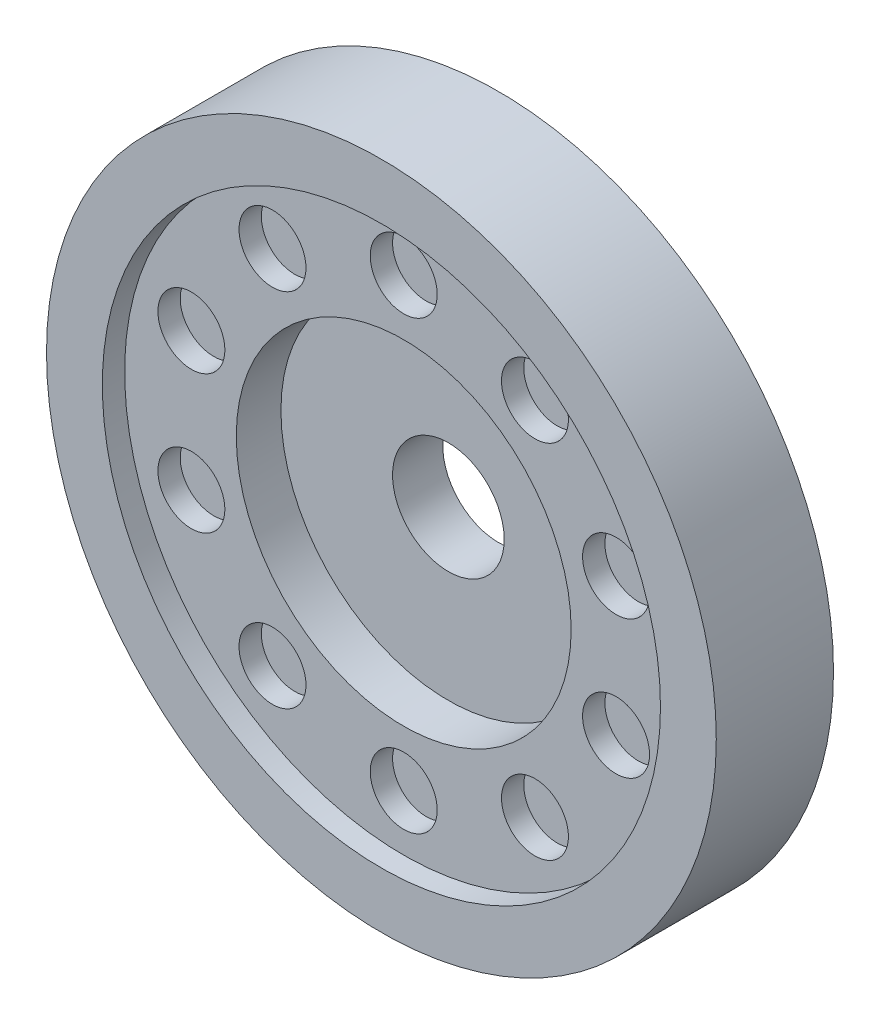
ISO-10303-21;
HEADER;
FILE_DESCRIPTION(('STEP AP214'),'2;1');
FILE_NAME('part.step','',(''),(''),'','','');
FILE_SCHEMA(('AUTOMOTIVE_DESIGN { 1 0 10303 214 1 1 1 1 }'));
ENDSEC;
DATA;
#1=APPLICATION_CONTEXT('core data for automotive mechanical design processes');
#2=APPLICATION_PROTOCOL_DEFINITION('international standard','automotive_design',2000,#1);
#3=PRODUCT_CONTEXT('',#1,'mechanical');
#4=PRODUCT('Part','Part','',(#3));
#5=PRODUCT_RELATED_PRODUCT_CATEGORY('part','',(#4));
#6=PRODUCT_DEFINITION_FORMATION('','',#4);
#7=PRODUCT_DEFINITION_CONTEXT('part definition',#1,'design');
#8=PRODUCT_DEFINITION('design','',#6,#7);
#9=PRODUCT_DEFINITION_SHAPE('','',#8);
#10=(LENGTH_UNIT() NAMED_UNIT(*) SI_UNIT(.MILLI.,.METRE.));
#11=(NAMED_UNIT(*) PLANE_ANGLE_UNIT() SI_UNIT($,.RADIAN.));
#12=(NAMED_UNIT(*) SI_UNIT($,.STERADIAN.) SOLID_ANGLE_UNIT());
#13=UNCERTAINTY_MEASURE_WITH_UNIT(LENGTH_MEASURE(1.E-05),#10,'distance_accuracy_value','');
#14=(GEOMETRIC_REPRESENTATION_CONTEXT(3) GLOBAL_UNCERTAINTY_ASSIGNED_CONTEXT((#13)) GLOBAL_UNIT_ASSIGNED_CONTEXT((#10,
#11,#12)) REPRESENTATION_CONTEXT('',''));
#15=CARTESIAN_POINT('',(0.,0.,0.));
#16=DIRECTION('',(0.,0.,1.));
#17=DIRECTION('',(1.,0.,0.));
#18=AXIS2_PLACEMENT_3D('',#15,#16,#17);
#19=CARTESIAN_POINT('',(0.,0.,133.35));
#20=DIRECTION('',(0.,0.,-1.));
#21=DIRECTION('',(-1.,0.,0.));
#22=AXIS2_PLACEMENT_3D('',#19,#20,#21);
#23=CYLINDRICAL_SURFACE('',#22,381.);
#24=CARTESIAN_POINT('',(0.,0.,133.35));
#25=DIRECTION('',(0.,0.,1.));
#26=DIRECTION('',(1.,0.,0.));
#27=AXIS2_PLACEMENT_3D('',#24,#25,#26);
#28=CIRCLE('',#27,381.);
#29=CARTESIAN_POINT('',(381.,0.,133.35));
#30=VERTEX_POINT('',#29);
#31=EDGE_CURVE('E10',#30,#30,#28,.T.);
#32=ORIENTED_EDGE('',*,*,#31,.F.);
#33=EDGE_LOOP('',(#32));
#34=FACE_BOUND('',#33,.T.);
#35=CARTESIAN_POINT('',(0.,0.,0.));
#36=DIRECTION('',(0.,0.,1.));
#37=DIRECTION('',(1.,0.,0.));
#38=AXIS2_PLACEMENT_3D('',#35,#36,#37);
#39=CIRCLE('',#38,381.);
#40=CARTESIAN_POINT('',(381.,0.,0.));
#41=VERTEX_POINT('',#40);
#42=EDGE_CURVE('E34',#41,#41,#39,.T.);
#43=ORIENTED_EDGE('',*,*,#42,.T.);
#44=EDGE_LOOP('',(#43));
#45=FACE_BOUND('',#44,.T.);
#46=ADVANCED_FACE('F31',(#34,#45),#23,.T.);
#47=CARTESIAN_POINT('',(0.,0.,133.35));
#48=DIRECTION('',(0.,0.,1.));
#49=DIRECTION('',(1.,0.,0.));
#50=AXIS2_PLACEMENT_3D('',#47,#48,#49);
#51=PLANE('',#50);
#52=CARTESIAN_POINT('',(0.,0.,133.35));
#53=DIRECTION('',(0.,0.,1.));
#54=DIRECTION('',(1.,0.,0.));
#55=AXIS2_PLACEMENT_3D('',#52,#53,#54);
#56=CIRCLE('',#55,317.5);
#57=CARTESIAN_POINT('',(317.5,0.,133.35));
#58=VERTEX_POINT('',#57);
#59=EDGE_CURVE('E43',#58,#58,#56,.T.);
#60=ORIENTED_EDGE('',*,*,#59,.F.);
#61=EDGE_LOOP('',(#60));
#62=FACE_BOUND('',#61,.T.);
#63=ORIENTED_EDGE('',*,*,#31,.T.);
#64=EDGE_LOOP('',(#63));
#65=FACE_BOUND('',#64,.T.);
#66=ADVANCED_FACE('F176',(#62,#65),#51,.T.);
#67=CARTESIAN_POINT('',(0.,0.,0.));
#68=DIRECTION('',(0.,0.,1.));
#69=DIRECTION('',(1.,0.,0.));
#70=AXIS2_PLACEMENT_3D('',#67,#68,#69);
#71=PLANE('',#70);
#72=CARTESIAN_POINT('',(0.,0.,0.));
#73=DIRECTION('',(0.,0.,1.));
#74=DIRECTION('',(1.,0.,0.));
#75=AXIS2_PLACEMENT_3D('',#72,#73,#74);
#76=CIRCLE('',#75,63.5);
#77=CARTESIAN_POINT('',(63.5,0.,0.));
#78=VERTEX_POINT('',#77);
#79=EDGE_CURVE('E112',#78,#78,#76,.T.);
#80=ORIENTED_EDGE('',*,*,#79,.T.);
#81=EDGE_LOOP('',(#80));
#82=FACE_BOUND('',#81,.T.);
#83=ORIENTED_EDGE('',*,*,#42,.F.);
#84=EDGE_LOOP('',(#83));
#85=FACE_BOUND('',#84,.T.);
#86=ADVANCED_FACE('F121',(#82,#85),#71,.F.);
#87=CARTESIAN_POINT('',(0.,0.,107.95));
#88=DIRECTION('',(0.,0.,1.));
#89=DIRECTION('',(1.,0.,0.));
#90=AXIS2_PLACEMENT_3D('',#87,#88,#89);
#91=CYLINDRICAL_SURFACE('',#90,317.5);
#92=CARTESIAN_POINT('',(0.,0.,107.95));
#93=DIRECTION('',(0.,0.,1.));
#94=DIRECTION('',(1.,0.,0.));
#95=AXIS2_PLACEMENT_3D('',#92,#93,#94);
#96=CIRCLE('',#95,317.5);
#97=CARTESIAN_POINT('',(317.5,0.,107.95));
#98=VERTEX_POINT('',#97);
#99=EDGE_CURVE('E41',#98,#98,#96,.T.);
#100=ORIENTED_EDGE('',*,*,#99,.F.);
#101=EDGE_LOOP('',(#100));
#102=FACE_BOUND('',#101,.T.);
#103=ORIENTED_EDGE('',*,*,#59,.T.);
#104=EDGE_LOOP('',(#103));
#105=FACE_BOUND('',#104,.T.);
#106=ADVANCED_FACE('F147',(#102,#105),#91,.F.);
#107=CARTESIAN_POINT('',(0.,0.,107.95));
#108=DIRECTION('',(0.,0.,1.));
#109=DIRECTION('',(1.,0.,0.));
#110=AXIS2_PLACEMENT_3D('',#107,#108,#109);
#111=PLANE('',#110);
#112=CARTESIAN_POINT('',(0.,0.,107.95));
#113=DIRECTION('',(0.,0.,1.));
#114=DIRECTION('',(1.,0.,0.));
#115=AXIS2_PLACEMENT_3D('',#112,#113,#114);
#116=CIRCLE('',#115,190.5);
#117=CARTESIAN_POINT('',(190.5,0.,107.95));
#118=VERTEX_POINT('',#117);
#119=EDGE_CURVE('E109',#118,#118,#116,.T.);
#120=ORIENTED_EDGE('',*,*,#119,.F.);
#121=EDGE_LOOP('',(#120));
#122=FACE_BOUND('',#121,.T.);
#123=CARTESIAN_POINT('',(149.297454082294,205.490316571254,107.95));
#124=DIRECTION('',(0.,0.,1.));
#125=DIRECTION('',(1.,0.,0.));
#126=AXIS2_PLACEMENT_3D('',#123,#124,#125);
#127=CIRCLE('',#126,38.1000000000007);
#128=CARTESIAN_POINT('',(187.397454082294,205.490316571254,107.95));
#129=VERTEX_POINT('',#128);
#130=EDGE_CURVE('E98',#129,#129,#127,.T.);
#131=ORIENTED_EDGE('',*,*,#130,.F.);
#132=EDGE_LOOP('',(#131));
#133=FACE_BOUND('',#132,.T.);
#134=CARTESIAN_POINT('',(241.568355138989,78.4903165712641,107.95));
#135=DIRECTION('',(0.,0.,1.));
#136=DIRECTION('',(1.,0.,0.));
#137=AXIS2_PLACEMENT_3D('',#134,#135,#136);
#138=CIRCLE('',#137,38.1000000000118);
#139=CARTESIAN_POINT('',(279.668355139001,78.4903165712641,107.95));
#140=VERTEX_POINT('',#139);
#141=EDGE_CURVE('E92',#140,#140,#138,.T.);
#142=ORIENTED_EDGE('',*,*,#141,.F.);
#143=EDGE_LOOP('',(#142));
#144=FACE_BOUND('',#143,.T.);
#145=CARTESIAN_POINT('',(241.568355139007,-78.4903165712092,107.95));
#146=DIRECTION('',(0.,0.,1.));
#147=DIRECTION('',(1.,0.,0.));
#148=AXIS2_PLACEMENT_3D('',#145,#146,#147);
#149=CIRCLE('',#148,38.1000000000292);
#150=CARTESIAN_POINT('',(279.668355139036,-78.4903165712092,107.95));
#151=VERTEX_POINT('',#150);
#152=EDGE_CURVE('E86',#151,#151,#149,.T.);
#153=ORIENTED_EDGE('',*,*,#152,.F.);
#154=EDGE_LOOP('',(#153));
#155=FACE_BOUND('',#154,.T.);
#156=CARTESIAN_POINT('',(149.29745408234,-205.49031657122,107.95));
#157=DIRECTION('',(0.,0.,1.));
#158=DIRECTION('',(1.,0.,0.));
#159=AXIS2_PLACEMENT_3D('',#156,#157,#158);
#160=CIRCLE('',#159,38.1000000000463);
#161=CARTESIAN_POINT('',(187.397454082387,-205.49031657122,107.95));
#162=VERTEX_POINT('',#161);
#163=EDGE_CURVE('E80',#162,#162,#160,.T.);
#164=ORIENTED_EDGE('',*,*,#163,.F.);
#165=EDGE_LOOP('',(#164));
#166=FACE_BOUND('',#165,.T.);
#167=CARTESIAN_POINT('',(5.76907015051843E-11,-254.,107.95));
#168=DIRECTION('',(0.,0.,1.));
#169=DIRECTION('',(1.,0.,0.));
#170=AXIS2_PLACEMENT_3D('',#167,#168,#169);
#171=CIRCLE('',#170,38.1000000000569);
#172=CARTESIAN_POINT('',(38.1000000001146,-254.,107.95));
#173=VERTEX_POINT('',#172);
#174=EDGE_CURVE('E74',#173,#173,#171,.T.);
#175=ORIENTED_EDGE('',*,*,#174,.F.);
#176=EDGE_LOOP('',(#175));
#177=FACE_BOUND('',#176,.T.);
#178=CARTESIAN_POINT('',(-149.297454082236,-205.490316571254,107.95));
#179=DIRECTION('',(0.,0.,1.));
#180=DIRECTION('',(1.,0.,0.));
#181=AXIS2_PLACEMENT_3D('',#178,#179,#180);
#182=CIRCLE('',#181,38.100000000057);
#183=CARTESIAN_POINT('',(-111.197454082179,-205.490316571254,107.95));
#184=VERTEX_POINT('',#183);
#185=EDGE_CURVE('E68',#184,#184,#182,.T.);
#186=ORIENTED_EDGE('',*,*,#185,.F.);
#187=EDGE_LOOP('',(#186));
#188=FACE_BOUND('',#187,.T.);
#189=CARTESIAN_POINT('',(-241.568355138931,-78.4903165712641,107.95));
#190=DIRECTION('',(0.,0.,1.));
#191=DIRECTION('',(1.,0.,0.));
#192=AXIS2_PLACEMENT_3D('',#189,#190,#191);
#193=CIRCLE('',#192,38.1000000000465);
#194=CARTESIAN_POINT('',(-203.468355138885,-78.4903165712641,107.95));
#195=VERTEX_POINT('',#194);
#196=EDGE_CURVE('E62',#195,#195,#193,.T.);
#197=ORIENTED_EDGE('',*,*,#196,.F.);
#198=EDGE_LOOP('',(#197));
#199=FACE_BOUND('',#198,.T.);
#200=CARTESIAN_POINT('',(-241.568355138949,78.4903165712092,107.95));
#201=DIRECTION('',(0.,0.,1.));
#202=DIRECTION('',(1.,0.,0.));
#203=AXIS2_PLACEMENT_3D('',#200,#201,#202);
#204=CIRCLE('',#203,38.1000000000299);
#205=CARTESIAN_POINT('',(-203.468355138919,78.4903165712092,107.95));
#206=VERTEX_POINT('',#205);
#207=EDGE_CURVE('E55',#206,#206,#204,.T.);
#208=ORIENTED_EDGE('',*,*,#207,.F.);
#209=EDGE_LOOP('',(#208));
#210=FACE_BOUND('',#209,.T.);
#211=CARTESIAN_POINT('',(-149.297454082283,205.49031657122,107.95));
#212=DIRECTION('',(0.,0.,1.));
#213=DIRECTION('',(1.,0.,0.));
#214=AXIS2_PLACEMENT_3D('',#211,#212,#213);
#215=CIRCLE('',#214,38.1000000000135);
#216=CARTESIAN_POINT('',(-111.197454082269,205.49031657122,107.95));
#217=VERTEX_POINT('',#216);
#218=EDGE_CURVE('E103',#217,#217,#215,.T.);
#219=ORIENTED_EDGE('',*,*,#218,.F.);
#220=EDGE_LOOP('',(#219));
#221=FACE_BOUND('',#220,.T.);
#222=CARTESIAN_POINT('',(0.,254.,107.95));
#223=DIRECTION('',(0.,0.,1.));
#224=DIRECTION('',(1.,0.,0.));
#225=AXIS2_PLACEMENT_3D('',#222,#223,#224);
#226=CIRCLE('',#225,38.1);
#227=CARTESIAN_POINT('',(38.1,254.,107.95));
#228=VERTEX_POINT('',#227);
#229=EDGE_CURVE('E49',#228,#228,#226,.T.);
#230=ORIENTED_EDGE('',*,*,#229,.F.);
#231=EDGE_LOOP('',(#230));
#232=FACE_BOUND('',#231,.T.);
#233=ORIENTED_EDGE('',*,*,#99,.T.);
#234=EDGE_LOOP('',(#233));
#235=FACE_BOUND('',#234,.T.);
#236=ADVANCED_FACE('F143',(#122,#133,#144,#155,#166,#177,#188,#199,#210,#221,#232,#235),#111,.T.);
#237=CARTESIAN_POINT('',(0.,254.,82.55));
#238=DIRECTION('',(0.,0.,1.));
#239=DIRECTION('',(1.,0.,0.));
#240=AXIS2_PLACEMENT_3D('',#237,#238,#239);
#241=CYLINDRICAL_SURFACE('',#240,38.1);
#242=CARTESIAN_POINT('',(0.,254.,82.55));
#243=DIRECTION('',(0.,0.,1.));
#244=DIRECTION('',(1.,0.,0.));
#245=AXIS2_PLACEMENT_3D('',#242,#243,#244);
#246=CIRCLE('',#245,38.1);
#247=CARTESIAN_POINT('',(38.1,254.,82.55));
#248=VERTEX_POINT('',#247);
#249=EDGE_CURVE('E46',#248,#248,#246,.T.);
#250=ORIENTED_EDGE('',*,*,#249,.F.);
#251=EDGE_LOOP('',(#250));
#252=FACE_BOUND('',#251,.T.);
#253=ORIENTED_EDGE('',*,*,#229,.T.);
#254=EDGE_LOOP('',(#253));
#255=FACE_BOUND('',#254,.T.);
#256=ADVANCED_FACE('F146',(#252,#255),#241,.F.);
#257=CARTESIAN_POINT('',(0.,254.,82.55));
#258=DIRECTION('',(0.,0.,1.));
#259=DIRECTION('',(1.,0.,0.));
#260=AXIS2_PLACEMENT_3D('',#257,#258,#259);
#261=PLANE('',#260);
#262=ORIENTED_EDGE('',*,*,#249,.T.);
#263=EDGE_LOOP('',(#262));
#264=FACE_BOUND('',#263,.T.);
#265=ADVANCED_FACE('F187',(#264),#261,.T.);
#266=CARTESIAN_POINT('',(-149.297454082283,205.49031657122,82.55));
#267=DIRECTION('',(0.,0.,1.));
#268=DIRECTION('',(1.,0.,0.));
#269=AXIS2_PLACEMENT_3D('',#266,#267,#268);
#270=CYLINDRICAL_SURFACE('',#269,38.1000000000135);
#271=CARTESIAN_POINT('',(-149.297454082283,205.49031657122,82.55));
#272=DIRECTION('',(0.,0.,1.));
#273=DIRECTION('',(1.,0.,0.));
#274=AXIS2_PLACEMENT_3D('',#271,#272,#273);
#275=CIRCLE('',#274,38.1000000000135);
#276=CARTESIAN_POINT('',(-111.197454082269,205.49031657122,82.55));
#277=VERTEX_POINT('',#276);
#278=EDGE_CURVE('E59',#277,#277,#275,.T.);
#279=ORIENTED_EDGE('',*,*,#278,.F.);
#280=EDGE_LOOP('',(#279));
#281=FACE_BOUND('',#280,.T.);
#282=ORIENTED_EDGE('',*,*,#218,.T.);
#283=EDGE_LOOP('',(#282));
#284=FACE_BOUND('',#283,.T.);
#285=ADVANCED_FACE('F191',(#281,#284),#270,.F.);
#286=CARTESIAN_POINT('',(-149.297454082283,205.49031657122,82.55));
#287=DIRECTION('',(0.,0.,1.));
#288=DIRECTION('',(1.,0.,0.));
#289=AXIS2_PLACEMENT_3D('',#286,#287,#288);
#290=PLANE('',#289);
#291=ORIENTED_EDGE('',*,*,#278,.T.);
#292=EDGE_LOOP('',(#291));
#293=FACE_BOUND('',#292,.T.);
#294=ADVANCED_FACE('F197',(#293),#290,.T.);
#295=CARTESIAN_POINT('',(-241.568355138949,78.4903165712092,82.55));
#296=DIRECTION('',(0.,0.,1.));
#297=DIRECTION('',(1.,0.,0.));
#298=AXIS2_PLACEMENT_3D('',#295,#296,#297);
#299=CYLINDRICAL_SURFACE('',#298,38.1000000000299);
#300=CARTESIAN_POINT('',(-241.568355138949,78.4903165712092,82.55));
#301=DIRECTION('',(0.,0.,1.));
#302=DIRECTION('',(1.,0.,0.));
#303=AXIS2_PLACEMENT_3D('',#300,#301,#302);
#304=CIRCLE('',#303,38.1000000000299);
#305=CARTESIAN_POINT('',(-203.468355138919,78.4903165712092,82.55));
#306=VERTEX_POINT('',#305);
#307=EDGE_CURVE('E58',#306,#306,#304,.T.);
#308=ORIENTED_EDGE('',*,*,#307,.F.);
#309=EDGE_LOOP('',(#308));
#310=FACE_BOUND('',#309,.T.);
#311=ORIENTED_EDGE('',*,*,#207,.T.);
#312=EDGE_LOOP('',(#311));
#313=FACE_BOUND('',#312,.T.);
#314=ADVANCED_FACE('F193',(#310,#313),#299,.F.);
#315=CARTESIAN_POINT('',(-241.568355138949,78.4903165712092,82.55));
#316=DIRECTION('',(0.,0.,1.));
#317=DIRECTION('',(1.,0.,0.));
#318=AXIS2_PLACEMENT_3D('',#315,#316,#317);
#319=PLANE('',#318);
#320=ORIENTED_EDGE('',*,*,#307,.T.);
#321=EDGE_LOOP('',(#320));
#322=FACE_BOUND('',#321,.T.);
#323=ADVANCED_FACE('F196',(#322),#319,.T.);
#324=CARTESIAN_POINT('',(-241.568355138931,-78.4903165712641,82.55));
#325=DIRECTION('',(0.,0.,1.));
#326=DIRECTION('',(1.,0.,0.));
#327=AXIS2_PLACEMENT_3D('',#324,#325,#326);
#328=CYLINDRICAL_SURFACE('',#327,38.1000000000465);
#329=CARTESIAN_POINT('',(-241.568355138931,-78.4903165712641,82.55));
#330=DIRECTION('',(0.,0.,1.));
#331=DIRECTION('',(1.,0.,0.));
#332=AXIS2_PLACEMENT_3D('',#329,#330,#331);
#333=CIRCLE('',#332,38.1000000000465);
#334=CARTESIAN_POINT('',(-203.468355138885,-78.4903165712641,82.55));
#335=VERTEX_POINT('',#334);
#336=EDGE_CURVE('E65',#335,#335,#333,.T.);
#337=ORIENTED_EDGE('',*,*,#336,.F.);
#338=EDGE_LOOP('',(#337));
#339=FACE_BOUND('',#338,.T.);
#340=ORIENTED_EDGE('',*,*,#196,.T.);
#341=EDGE_LOOP('',(#340));
#342=FACE_BOUND('',#341,.T.);
#343=ADVANCED_FACE('F201',(#339,#342),#328,.F.);
#344=CARTESIAN_POINT('',(-241.568355138931,-78.4903165712641,82.55));
#345=DIRECTION('',(0.,0.,1.));
#346=DIRECTION('',(1.,0.,0.));
#347=AXIS2_PLACEMENT_3D('',#344,#345,#346);
#348=PLANE('',#347);
#349=ORIENTED_EDGE('',*,*,#336,.T.);
#350=EDGE_LOOP('',(#349));
#351=FACE_BOUND('',#350,.T.);
#352=ADVANCED_FACE('F205',(#351),#348,.T.);
#353=CARTESIAN_POINT('',(-149.297454082236,-205.490316571254,82.55));
#354=DIRECTION('',(0.,0.,1.));
#355=DIRECTION('',(1.,0.,0.));
#356=AXIS2_PLACEMENT_3D('',#353,#354,#355);
#357=CYLINDRICAL_SURFACE('',#356,38.100000000057);
#358=CARTESIAN_POINT('',(-149.297454082236,-205.490316571254,82.55));
#359=DIRECTION('',(0.,0.,1.));
#360=DIRECTION('',(1.,0.,0.));
#361=AXIS2_PLACEMENT_3D('',#358,#359,#360);
#362=CIRCLE('',#361,38.100000000057);
#363=CARTESIAN_POINT('',(-111.197454082179,-205.490316571254,82.55));
#364=VERTEX_POINT('',#363);
#365=EDGE_CURVE('E71',#364,#364,#362,.T.);
#366=ORIENTED_EDGE('',*,*,#365,.F.);
#367=EDGE_LOOP('',(#366));
#368=FACE_BOUND('',#367,.T.);
#369=ORIENTED_EDGE('',*,*,#185,.T.);
#370=EDGE_LOOP('',(#369));
#371=FACE_BOUND('',#370,.T.);
#372=ADVANCED_FACE('F209',(#368,#371),#357,.F.);
#373=CARTESIAN_POINT('',(-149.297454082236,-205.490316571254,82.55));
#374=DIRECTION('',(0.,0.,1.));
#375=DIRECTION('',(1.,0.,0.));
#376=AXIS2_PLACEMENT_3D('',#373,#374,#375);
#377=PLANE('',#376);
#378=ORIENTED_EDGE('',*,*,#365,.T.);
#379=EDGE_LOOP('',(#378));
#380=FACE_BOUND('',#379,.T.);
#381=ADVANCED_FACE('F213',(#380),#377,.T.);
#382=CARTESIAN_POINT('',(5.76907015051843E-11,-254.,82.55));
#383=DIRECTION('',(0.,0.,1.));
#384=DIRECTION('',(1.,0.,0.));
#385=AXIS2_PLACEMENT_3D('',#382,#383,#384);
#386=CYLINDRICAL_SURFACE('',#385,38.1000000000569);
#387=CARTESIAN_POINT('',(5.76907015051843E-11,-254.,82.55));
#388=DIRECTION('',(0.,0.,1.));
#389=DIRECTION('',(1.,0.,0.));
#390=AXIS2_PLACEMENT_3D('',#387,#388,#389);
#391=CIRCLE('',#390,38.1000000000569);
#392=CARTESIAN_POINT('',(38.1000000001146,-254.,82.55));
#393=VERTEX_POINT('',#392);
#394=EDGE_CURVE('E77',#393,#393,#391,.T.);
#395=ORIENTED_EDGE('',*,*,#394,.F.);
#396=EDGE_LOOP('',(#395));
#397=FACE_BOUND('',#396,.T.);
#398=ORIENTED_EDGE('',*,*,#174,.T.);
#399=EDGE_LOOP('',(#398));
#400=FACE_BOUND('',#399,.T.);
#401=ADVANCED_FACE('F217',(#397,#400),#386,.F.);
#402=CARTESIAN_POINT('',(5.76907015051843E-11,-254.,82.55));
#403=DIRECTION('',(0.,0.,1.));
#404=DIRECTION('',(1.,0.,0.));
#405=AXIS2_PLACEMENT_3D('',#402,#403,#404);
#406=PLANE('',#405);
#407=ORIENTED_EDGE('',*,*,#394,.T.);
#408=EDGE_LOOP('',(#407));
#409=FACE_BOUND('',#408,.T.);
#410=ADVANCED_FACE('F221',(#409),#406,.T.);
#411=CARTESIAN_POINT('',(149.29745408234,-205.49031657122,82.55));
#412=DIRECTION('',(0.,0.,1.));
#413=DIRECTION('',(1.,0.,0.));
#414=AXIS2_PLACEMENT_3D('',#411,#412,#413);
#415=CYLINDRICAL_SURFACE('',#414,38.1000000000463);
#416=CARTESIAN_POINT('',(149.29745408234,-205.49031657122,82.55));
#417=DIRECTION('',(0.,0.,1.));
#418=DIRECTION('',(1.,0.,0.));
#419=AXIS2_PLACEMENT_3D('',#416,#417,#418);
#420=CIRCLE('',#419,38.1000000000463);
#421=CARTESIAN_POINT('',(187.397454082387,-205.49031657122,82.55));
#422=VERTEX_POINT('',#421);
#423=EDGE_CURVE('E83',#422,#422,#420,.T.);
#424=ORIENTED_EDGE('',*,*,#423,.F.);
#425=EDGE_LOOP('',(#424));
#426=FACE_BOUND('',#425,.T.);
#427=ORIENTED_EDGE('',*,*,#163,.T.);
#428=EDGE_LOOP('',(#427));
#429=FACE_BOUND('',#428,.T.);
#430=ADVANCED_FACE('F225',(#426,#429),#415,.F.);
#431=CARTESIAN_POINT('',(149.29745408234,-205.49031657122,82.55));
#432=DIRECTION('',(0.,0.,1.));
#433=DIRECTION('',(1.,0.,0.));
#434=AXIS2_PLACEMENT_3D('',#431,#432,#433);
#435=PLANE('',#434);
#436=ORIENTED_EDGE('',*,*,#423,.T.);
#437=EDGE_LOOP('',(#436));
#438=FACE_BOUND('',#437,.T.);
#439=ADVANCED_FACE('F229',(#438),#435,.T.);
#440=CARTESIAN_POINT('',(241.568355139007,-78.4903165712092,82.55));
#441=DIRECTION('',(0.,0.,1.));
#442=DIRECTION('',(1.,0.,0.));
#443=AXIS2_PLACEMENT_3D('',#440,#441,#442);
#444=CYLINDRICAL_SURFACE('',#443,38.1000000000292);
#445=CARTESIAN_POINT('',(241.568355139007,-78.4903165712092,82.55));
#446=DIRECTION('',(0.,0.,1.));
#447=DIRECTION('',(1.,0.,0.));
#448=AXIS2_PLACEMENT_3D('',#445,#446,#447);
#449=CIRCLE('',#448,38.1000000000292);
#450=CARTESIAN_POINT('',(279.668355139036,-78.4903165712092,82.55));
#451=VERTEX_POINT('',#450);
#452=EDGE_CURVE('E89',#451,#451,#449,.T.);
#453=ORIENTED_EDGE('',*,*,#452,.F.);
#454=EDGE_LOOP('',(#453));
#455=FACE_BOUND('',#454,.T.);
#456=ORIENTED_EDGE('',*,*,#152,.T.);
#457=EDGE_LOOP('',(#456));
#458=FACE_BOUND('',#457,.T.);
#459=ADVANCED_FACE('F233',(#455,#458),#444,.F.);
#460=CARTESIAN_POINT('',(241.568355139007,-78.4903165712092,82.55));
#461=DIRECTION('',(0.,0.,1.));
#462=DIRECTION('',(1.,0.,0.));
#463=AXIS2_PLACEMENT_3D('',#460,#461,#462);
#464=PLANE('',#463);
#465=ORIENTED_EDGE('',*,*,#452,.T.);
#466=EDGE_LOOP('',(#465));
#467=FACE_BOUND('',#466,.T.);
#468=ADVANCED_FACE('F237',(#467),#464,.T.);
#469=CARTESIAN_POINT('',(241.568355138989,78.4903165712641,82.55));
#470=DIRECTION('',(0.,0.,1.));
#471=DIRECTION('',(1.,0.,0.));
#472=AXIS2_PLACEMENT_3D('',#469,#470,#471);
#473=CYLINDRICAL_SURFACE('',#472,38.1000000000118);
#474=CARTESIAN_POINT('',(241.568355138989,78.4903165712641,82.55));
#475=DIRECTION('',(0.,0.,1.));
#476=DIRECTION('',(1.,0.,0.));
#477=AXIS2_PLACEMENT_3D('',#474,#475,#476);
#478=CIRCLE('',#477,38.1000000000118);
#479=CARTESIAN_POINT('',(279.668355139001,78.4903165712641,82.55));
#480=VERTEX_POINT('',#479);
#481=EDGE_CURVE('E95',#480,#480,#478,.T.);
#482=ORIENTED_EDGE('',*,*,#481,.F.);
#483=EDGE_LOOP('',(#482));
#484=FACE_BOUND('',#483,.T.);
#485=ORIENTED_EDGE('',*,*,#141,.T.);
#486=EDGE_LOOP('',(#485));
#487=FACE_BOUND('',#486,.T.);
#488=ADVANCED_FACE('F241',(#484,#487),#473,.F.);
#489=CARTESIAN_POINT('',(241.568355138989,78.4903165712641,82.55));
#490=DIRECTION('',(0.,0.,1.));
#491=DIRECTION('',(1.,0.,0.));
#492=AXIS2_PLACEMENT_3D('',#489,#490,#491);
#493=PLANE('',#492);
#494=ORIENTED_EDGE('',*,*,#481,.T.);
#495=EDGE_LOOP('',(#494));
#496=FACE_BOUND('',#495,.T.);
#497=ADVANCED_FACE('F245',(#496),#493,.T.);
#498=CARTESIAN_POINT('',(149.297454082294,205.490316571254,82.55));
#499=DIRECTION('',(0.,0.,1.));
#500=DIRECTION('',(1.,0.,0.));
#501=AXIS2_PLACEMENT_3D('',#498,#499,#500);
#502=CYLINDRICAL_SURFACE('',#501,38.1000000000007);
#503=CARTESIAN_POINT('',(149.297454082294,205.490316571254,82.55));
#504=DIRECTION('',(0.,0.,1.));
#505=DIRECTION('',(1.,0.,0.));
#506=AXIS2_PLACEMENT_3D('',#503,#504,#505);
#507=CIRCLE('',#506,38.1000000000007);
#508=CARTESIAN_POINT('',(187.397454082294,205.490316571254,82.55));
#509=VERTEX_POINT('',#508);
#510=EDGE_CURVE('E52',#509,#509,#507,.T.);
#511=ORIENTED_EDGE('',*,*,#510,.F.);
#512=EDGE_LOOP('',(#511));
#513=FACE_BOUND('',#512,.T.);
#514=ORIENTED_EDGE('',*,*,#130,.T.);
#515=EDGE_LOOP('',(#514));
#516=FACE_BOUND('',#515,.T.);
#517=ADVANCED_FACE('F249',(#513,#516),#502,.F.);
#518=CARTESIAN_POINT('',(149.297454082294,205.490316571254,82.55));
#519=DIRECTION('',(0.,0.,1.));
#520=DIRECTION('',(1.,0.,0.));
#521=AXIS2_PLACEMENT_3D('',#518,#519,#520);
#522=PLANE('',#521);
#523=ORIENTED_EDGE('',*,*,#510,.T.);
#524=EDGE_LOOP('',(#523));
#525=FACE_BOUND('',#524,.T.);
#526=ADVANCED_FACE('F139',(#525),#522,.T.);
#527=CARTESIAN_POINT('',(0.,0.,57.15));
#528=DIRECTION('',(0.,0.,1.));
#529=DIRECTION('',(1.,0.,0.));
#530=AXIS2_PLACEMENT_3D('',#527,#528,#529);
#531=CYLINDRICAL_SURFACE('',#530,190.5);
#532=CARTESIAN_POINT('',(0.,0.,57.15));
#533=DIRECTION('',(0.,0.,1.));
#534=DIRECTION('',(1.,0.,0.));
#535=AXIS2_PLACEMENT_3D('',#532,#533,#534);
#536=CIRCLE('',#535,190.5);
#537=CARTESIAN_POINT('',(190.5,0.,57.15));
#538=VERTEX_POINT('',#537);
#539=EDGE_CURVE('E106',#538,#538,#536,.T.);
#540=ORIENTED_EDGE('',*,*,#539,.F.);
#541=EDGE_LOOP('',(#540));
#542=FACE_BOUND('',#541,.T.);
#543=ORIENTED_EDGE('',*,*,#119,.T.);
#544=EDGE_LOOP('',(#543));
#545=FACE_BOUND('',#544,.T.);
#546=ADVANCED_FACE('F133',(#542,#545),#531,.F.);
#547=CARTESIAN_POINT('',(0.,0.,57.15));
#548=DIRECTION('',(0.,0.,1.));
#549=DIRECTION('',(1.,0.,0.));
#550=AXIS2_PLACEMENT_3D('',#547,#548,#549);
#551=PLANE('',#550);
#552=CARTESIAN_POINT('',(0.,0.,57.15));
#553=DIRECTION('',(0.,0.,1.));
#554=DIRECTION('',(1.,0.,0.));
#555=AXIS2_PLACEMENT_3D('',#552,#553,#554);
#556=CIRCLE('',#555,63.5);
#557=CARTESIAN_POINT('',(63.5,0.,57.15));
#558=VERTEX_POINT('',#557);
#559=EDGE_CURVE('E115',#558,#558,#556,.T.);
#560=ORIENTED_EDGE('',*,*,#559,.F.);
#561=EDGE_LOOP('',(#560));
#562=FACE_BOUND('',#561,.T.);
#563=ORIENTED_EDGE('',*,*,#539,.T.);
#564=EDGE_LOOP('',(#563));
#565=FACE_BOUND('',#564,.T.);
#566=ADVANCED_FACE('F127',(#562,#565),#551,.T.);
#567=CARTESIAN_POINT('',(0.,0.,0.));
#568=DIRECTION('',(0.,0.,1.));
#569=DIRECTION('',(1.,0.,0.));
#570=AXIS2_PLACEMENT_3D('',#567,#568,#569);
#571=CYLINDRICAL_SURFACE('',#570,63.5);
#572=ORIENTED_EDGE('',*,*,#79,.F.);
#573=EDGE_LOOP('',(#572));
#574=FACE_BOUND('',#573,.T.);
#575=ORIENTED_EDGE('',*,*,#559,.T.);
#576=EDGE_LOOP('',(#575));
#577=FACE_BOUND('',#576,.T.);
#578=ADVANCED_FACE('F124',(#574,#577),#571,.F.);
#579=CLOSED_SHELL('',(#46,#66,#86,#106,#236,#256,#265,#285,#294,#314,#323,#343,#352,#372,#381,
#401,#410,#430,#439,#459,#468,#488,#497,#517,#526,#546,#566,#578));
#580=MANIFOLD_SOLID_BREP('B2',#579);
#581=ADVANCED_BREP_SHAPE_REPRESENTATION('',(#18,#580),#14);
#582=SHAPE_DEFINITION_REPRESENTATION(#9,#581);
ENDSEC;
END-ISO-10303-21;
